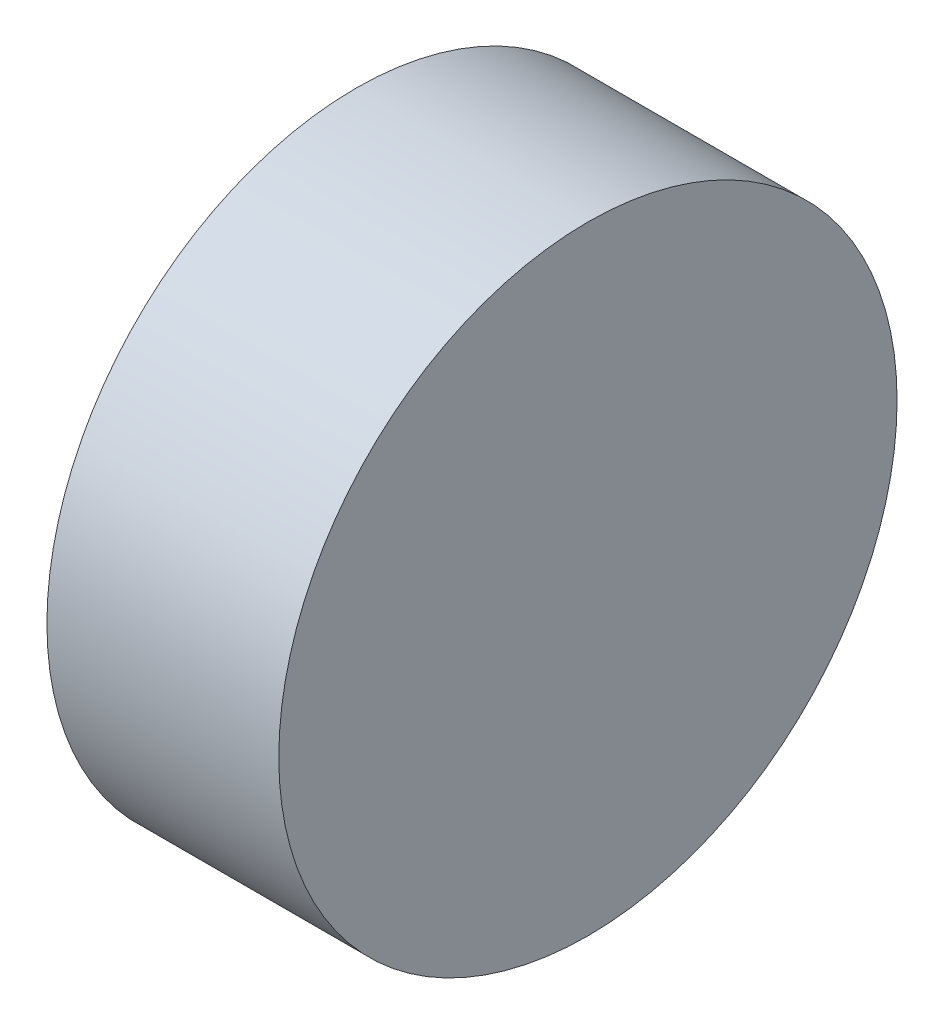
ISO-10303-21;
HEADER;
FILE_DESCRIPTION(('STEP AP214'),'2;1');
FILE_NAME('part.step','',(''),(''),'','','');
FILE_SCHEMA(('AUTOMOTIVE_DESIGN { 1 0 10303 214 1 1 1 1 }'));
ENDSEC;
DATA;
#1=APPLICATION_CONTEXT('core data for automotive mechanical design processes');
#2=APPLICATION_PROTOCOL_DEFINITION('international standard','automotive_design',2000,#1);
#3=PRODUCT_CONTEXT('',#1,'mechanical');
#4=PRODUCT('Part','Part','',(#3));
#5=PRODUCT_RELATED_PRODUCT_CATEGORY('part','',(#4));
#6=PRODUCT_DEFINITION_FORMATION('','',#4);
#7=PRODUCT_DEFINITION_CONTEXT('part definition',#1,'design');
#8=PRODUCT_DEFINITION('design','',#6,#7);
#9=PRODUCT_DEFINITION_SHAPE('','',#8);
#10=(LENGTH_UNIT() NAMED_UNIT(*) SI_UNIT(.MILLI.,.METRE.));
#11=(NAMED_UNIT(*) PLANE_ANGLE_UNIT() SI_UNIT($,.RADIAN.));
#12=(NAMED_UNIT(*) SI_UNIT($,.STERADIAN.) SOLID_ANGLE_UNIT());
#13=UNCERTAINTY_MEASURE_WITH_UNIT(LENGTH_MEASURE(1.E-05),#10,'distance_accuracy_value','');
#14=(GEOMETRIC_REPRESENTATION_CONTEXT(3) GLOBAL_UNCERTAINTY_ASSIGNED_CONTEXT((#13)) GLOBAL_UNIT_ASSIGNED_CONTEXT((#10,
#11,#12)) REPRESENTATION_CONTEXT('',''));
#15=CARTESIAN_POINT('',(0.,0.,0.));
#16=DIRECTION('',(0.,0.,1.));
#17=DIRECTION('',(1.,0.,0.));
#18=AXIS2_PLACEMENT_3D('',#15,#16,#17);
#19=CARTESIAN_POINT('',(3.,0.,0.));
#20=DIRECTION('',(1.,0.,0.));
#21=DIRECTION('',(0.,0.,-1.));
#22=AXIS2_PLACEMENT_3D('',#19,#20,#21);
#23=PLANE('',#22);
#24=CARTESIAN_POINT('',(3.,0.,0.));
#25=DIRECTION('',(-1.,0.,0.));
#26=DIRECTION('',(0.,0.,1.));
#27=AXIS2_PLACEMENT_3D('',#24,#25,#26);
#28=CIRCLE('',#27,8.);
#29=CARTESIAN_POINT('',(3.,0.,8.));
#30=VERTEX_POINT('',#29);
#31=EDGE_CURVE('E9',#30,#30,#28,.T.);
#32=ORIENTED_EDGE('',*,*,#31,.F.);
#33=EDGE_LOOP('',(#32));
#34=FACE_BOUND('',#33,.T.);
#35=ADVANCED_FACE('F14',(#34),#23,.T.);
#36=CARTESIAN_POINT('',(-3.,0.,0.));
#37=DIRECTION('',(-1.,0.,0.));
#38=DIRECTION('',(0.,0.,1.));
#39=AXIS2_PLACEMENT_3D('',#36,#37,#38);
#40=PLANE('',#39);
#41=CARTESIAN_POINT('',(-3.,0.,0.));
#42=DIRECTION('',(1.,0.,0.));
#43=DIRECTION('',(0.,0.,-1.));
#44=AXIS2_PLACEMENT_3D('',#41,#42,#43);
#45=CIRCLE('',#44,8.);
#46=CARTESIAN_POINT('',(-3.,0.,-8.));
#47=VERTEX_POINT('',#46);
#48=EDGE_CURVE('E21',#47,#47,#45,.T.);
#49=ORIENTED_EDGE('',*,*,#48,.F.);
#50=EDGE_LOOP('',(#49));
#51=FACE_BOUND('',#50,.T.);
#52=ADVANCED_FACE('F28',(#51),#40,.T.);
#53=CARTESIAN_POINT('',(-3.,0.,0.));
#54=DIRECTION('',(1.,0.,0.));
#55=DIRECTION('',(0.,0.,-1.));
#56=AXIS2_PLACEMENT_3D('',#53,#54,#55);
#57=CYLINDRICAL_SURFACE('',#56,8.);
#58=ORIENTED_EDGE('',*,*,#31,.T.);
#59=EDGE_LOOP('',(#58));
#60=FACE_BOUND('',#59,.T.);
#61=ORIENTED_EDGE('',*,*,#48,.T.);
#62=EDGE_LOOP('',(#61));
#63=FACE_BOUND('',#62,.T.);
#64=ADVANCED_FACE('F16',(#60,#63),#57,.T.);
#65=CLOSED_SHELL('',(#35,#52,#64));
#66=MANIFOLD_SOLID_BREP('B1',#65);
#67=ADVANCED_BREP_SHAPE_REPRESENTATION('',(#18,#66),#14);
#68=SHAPE_DEFINITION_REPRESENTATION(#9,#67);
ENDSEC;
END-ISO-10303-21;
